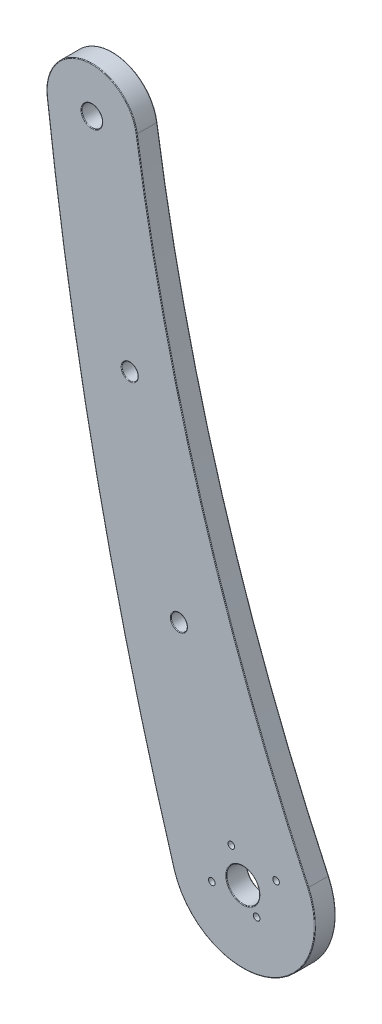
ISO-10303-21;
HEADER;
FILE_DESCRIPTION(('STEP AP214'),'2;1');
FILE_NAME('part.step','',(''),(''),'','','');
FILE_SCHEMA(('AUTOMOTIVE_DESIGN { 1 0 10303 214 1 1 1 1 }'));
ENDSEC;
DATA;
#1=APPLICATION_CONTEXT('core data for automotive mechanical design processes');
#2=APPLICATION_PROTOCOL_DEFINITION('international standard','automotive_design',2000,#1);
#3=PRODUCT_CONTEXT('',#1,'mechanical');
#4=PRODUCT('Part','Part','',(#3));
#5=PRODUCT_RELATED_PRODUCT_CATEGORY('part','',(#4));
#6=PRODUCT_DEFINITION_FORMATION('','',#4);
#7=PRODUCT_DEFINITION_CONTEXT('part definition',#1,'design');
#8=PRODUCT_DEFINITION('design','',#6,#7);
#9=PRODUCT_DEFINITION_SHAPE('','',#8);
#10=(LENGTH_UNIT() NAMED_UNIT(*) SI_UNIT(.MILLI.,.METRE.));
#11=(NAMED_UNIT(*) PLANE_ANGLE_UNIT() SI_UNIT($,.RADIAN.));
#12=(NAMED_UNIT(*) SI_UNIT($,.STERADIAN.) SOLID_ANGLE_UNIT());
#13=UNCERTAINTY_MEASURE_WITH_UNIT(LENGTH_MEASURE(1.E-05),#10,'distance_accuracy_value','');
#14=(GEOMETRIC_REPRESENTATION_CONTEXT(3) GLOBAL_UNCERTAINTY_ASSIGNED_CONTEXT((#13)) GLOBAL_UNIT_ASSIGNED_CONTEXT((#10,
#11,#12)) REPRESENTATION_CONTEXT('',''));
#15=CARTESIAN_POINT('',(0.,0.,0.));
#16=DIRECTION('',(0.,0.,1.));
#17=DIRECTION('',(1.,0.,0.));
#18=AXIS2_PLACEMENT_3D('',#15,#16,#17);
#19=CARTESIAN_POINT('',(359.713283100028,250.324845308075,5.));
#20=DIRECTION('',(0.,0.,1.));
#21=DIRECTION('',(1.,0.,0.));
#22=AXIS2_PLACEMENT_3D('',#19,#20,#21);
#23=PLANE('',#22);
#24=CARTESIAN_POINT('',(-27.7406146200843,54.6087694983637,5.));
#25=DIRECTION('',(0.,0.,1.));
#26=DIRECTION('',(1.,0.,0.));
#27=AXIS2_PLACEMENT_3D('',#24,#25,#26);
#28=CIRCLE('',#27,0.800000000000006);
#29=CARTESIAN_POINT('',(-26.9406146200843,54.6087694983637,5.));
#30=VERTEX_POINT('',#29);
#31=EDGE_CURVE('E266',#30,#30,#28,.T.);
#32=ORIENTED_EDGE('',*,*,#31,.F.);
#33=EDGE_LOOP('',(#32));
#34=FACE_BOUND('',#33,.T.);
#35=CARTESIAN_POINT('',(-16.8774012050253,52.580076742207,5.));
#36=DIRECTION('',(0.,0.,1.));
#37=DIRECTION('',(1.,0.,0.));
#38=AXIS2_PLACEMENT_3D('',#35,#36,#37);
#39=CIRCLE('',#38,0.800000000000006);
#40=CARTESIAN_POINT('',(-16.0774012050253,52.580076742207,5.));
#41=VERTEX_POINT('',#40);
#42=EDGE_CURVE('E260',#41,#41,#39,.T.);
#43=ORIENTED_EDGE('',*,*,#42,.F.);
#44=EDGE_LOOP('',(#43));
#45=FACE_BOUND('',#44,.T.);
#46=CARTESIAN_POINT('',(-23.0208688867139,64.6012166567095,5.));
#47=DIRECTION('',(0.,0.,1.));
#48=DIRECTION('',(1.,0.,0.));
#49=AXIS2_PLACEMENT_3D('',#46,#47,#48);
#50=CIRCLE('',#49,0.800000000000004);
#51=CARTESIAN_POINT('',(-22.2208688867139,64.6012166567095,5.));
#52=VERTEX_POINT('',#51);
#53=EDGE_CURVE('E254',#52,#52,#50,.T.);
#54=ORIENTED_EDGE('',*,*,#53,.F.);
#55=EDGE_LOOP('',(#54));
#56=FACE_BOUND('',#55,.T.);
#57=CARTESIAN_POINT('',(-12.157655471655,62.5725239005527,5.));
#58=DIRECTION('',(0.,0.,1.));
#59=DIRECTION('',(1.,0.,0.));
#60=AXIS2_PLACEMENT_3D('',#57,#58,#59);
#61=CIRCLE('',#60,0.799999999999994);
#62=CARTESIAN_POINT('',(-11.357655471655,62.5725239005527,5.));
#63=VERTEX_POINT('',#62);
#64=EDGE_CURVE('E248',#63,#63,#61,.T.);
#65=ORIENTED_EDGE('',*,*,#64,.F.);
#66=EDGE_LOOP('',(#65));
#67=FACE_BOUND('',#66,.T.);
#68=CARTESIAN_POINT('',(-20.2200000000001,57.5800000000001,5.));
#69=DIRECTION('',(0.,0.,1.));
#70=DIRECTION('',(1.,0.,0.));
#71=AXIS2_PLACEMENT_3D('',#68,#69,#70);
#72=CIRCLE('',#71,4.15);
#73=CARTESIAN_POINT('',(-16.0700000000001,57.5800000000001,5.));
#74=VERTEX_POINT('',#73);
#75=EDGE_CURVE('E11',#74,#74,#72,.F.);
#76=ORIENTED_EDGE('',*,*,#75,.T.);
#77=EDGE_LOOP('',(#76));
#78=FACE_BOUND('',#77,.T.);
#79=CARTESIAN_POINT('',(-20.22,57.58,5.));
#80=DIRECTION('',(0.,0.,1.));
#81=DIRECTION('',(1.,0.,0.));
#82=AXIS2_PLACEMENT_3D('',#79,#80,#81);
#83=CIRCLE('',#82,17.3499999999998);
#84=CARTESIAN_POINT('',(-36.8201416739153,52.5344280397623,5.));
#85=VERTEX_POINT('',#84);
#86=CARTESIAN_POINT('',(-4.50781058356829,64.9386414331836,5.));
#87=VERTEX_POINT('',#86);
#88=EDGE_CURVE('E49',#85,#87,#83,.T.);
#89=ORIENTED_EDGE('',*,*,#88,.T.);
#90=CARTESIAN_POINT('',(448.428877406544,277.066855427805,5.));
#91=DIRECTION('',(0.,0.,1.));
#92=DIRECTION('',(1.,0.,0.));
#93=AXIS2_PLACEMENT_3D('',#90,#91,#92);
#94=CIRCLE('',#93,500.15);
#95=CARTESIAN_POINT('',(-46.1441832858885,202.585246037838,5.));
#96=VERTEX_POINT('',#95);
#97=EDGE_CURVE('E41',#87,#96,#94,.F.);
#98=ORIENTED_EDGE('',*,*,#97,.T.);
#99=CARTESIAN_POINT('',(-56.8731999979007,200.969479843934,5.));
#100=DIRECTION('',(0.,0.,1.));
#101=DIRECTION('',(1.,0.,0.));
#102=AXIS2_PLACEMENT_3D('',#99,#100,#101);
#103=CIRCLE('',#102,10.8499999999999);
#104=CARTESIAN_POINT('',(-67.6478444355944,199.692946553622,5.));
#105=VERTEX_POINT('',#104);
#106=EDGE_CURVE('E186',#96,#105,#103,.T.);
#107=ORIENTED_EDGE('',*,*,#106,.T.);
#108=CARTESIAN_POINT('',(776.299766197957,299.680210772216,5.));
#109=DIRECTION('',(0.,0.,1.));
#110=DIRECTION('',(1.,0.,0.));
#111=AXIS2_PLACEMENT_3D('',#108,#109,#110);
#112=CIRCLE('',#111,849.85);
#113=EDGE_CURVE('E54',#105,#85,#112,.T.);
#114=ORIENTED_EDGE('',*,*,#113,.T.);
#115=EDGE_LOOP('',(#89,#98,#107,#114));
#116=FACE_BOUND('',#115,.T.);
#117=CARTESIAN_POINT('',(-56.8731999979007,200.969479843934,5.));
#118=DIRECTION('',(0.,0.,1.));
#119=DIRECTION('',(1.,0.,0.));
#120=AXIS2_PLACEMENT_3D('',#117,#118,#119);
#121=CIRCLE('',#120,2.65000000000001);
#122=CARTESIAN_POINT('',(-54.2231999979007,200.969479843934,5.));
#123=VERTEX_POINT('',#122);
#124=EDGE_CURVE('E183',#123,#123,#121,.F.);
#125=ORIENTED_EDGE('',*,*,#124,.T.);
#126=EDGE_LOOP('',(#125));
#127=FACE_BOUND('',#126,.T.);
#128=CARTESIAN_POINT('',(-35.7464202873909,105.108205026692,5.));
#129=DIRECTION('',(0.,0.,1.));
#130=DIRECTION('',(1.,0.,0.));
#131=AXIS2_PLACEMENT_3D('',#128,#129,#130);
#132=CIRCLE('',#131,2.09999999999999);
#133=CARTESIAN_POINT('',(-33.6464202873909,105.108205026692,5.));
#134=VERTEX_POINT('',#133);
#135=EDGE_CURVE('E180',#134,#134,#132,.F.);
#136=ORIENTED_EDGE('',*,*,#135,.T.);
#137=EDGE_LOOP('',(#136));
#138=FACE_BOUND('',#137,.T.);
#139=CARTESIAN_POINT('',(-47.6870315612747,151.820580472188,5.));
#140=DIRECTION('',(0.,0.,1.));
#141=DIRECTION('',(1.,0.,0.));
#142=AXIS2_PLACEMENT_3D('',#139,#140,#141);
#143=CIRCLE('',#142,2.09999999999999);
#144=CARTESIAN_POINT('',(-45.5870315612747,151.820580472188,5.));
#145=VERTEX_POINT('',#144);
#146=EDGE_CURVE('E177',#145,#145,#143,.F.);
#147=ORIENTED_EDGE('',*,*,#146,.T.);
#148=EDGE_LOOP('',(#147));
#149=FACE_BOUND('',#148,.T.);
#150=ADVANCED_FACE('F32',(#34,#45,#56,#67,#78,#116,#127,#138,#149),#23,.T.);
#151=CARTESIAN_POINT('',(359.713283100028,250.324845308075,0.));
#152=DIRECTION('',(0.,0.,1.));
#153=DIRECTION('',(1.,0.,0.));
#154=AXIS2_PLACEMENT_3D('',#151,#152,#153);
#155=PLANE('',#154);
#156=CARTESIAN_POINT('',(-27.7406146200843,54.6087694983637,0.));
#157=DIRECTION('',(0.,0.,1.));
#158=DIRECTION('',(1.,0.,0.));
#159=AXIS2_PLACEMENT_3D('',#156,#157,#158);
#160=CIRCLE('',#159,0.800000000000006);
#161=CARTESIAN_POINT('',(-26.9406146200843,54.6087694983637,0.));
#162=VERTEX_POINT('',#161);
#163=EDGE_CURVE('E199',#162,#162,#160,.T.);
#164=ORIENTED_EDGE('',*,*,#163,.T.);
#165=EDGE_LOOP('',(#164));
#166=FACE_BOUND('',#165,.T.);
#167=CARTESIAN_POINT('',(-16.8774012050253,52.580076742207,0.));
#168=DIRECTION('',(0.,0.,1.));
#169=DIRECTION('',(1.,0.,0.));
#170=AXIS2_PLACEMENT_3D('',#167,#168,#169);
#171=CIRCLE('',#170,0.800000000000006);
#172=CARTESIAN_POINT('',(-16.0774012050253,52.580076742207,0.));
#173=VERTEX_POINT('',#172);
#174=EDGE_CURVE('E263',#173,#173,#171,.T.);
#175=ORIENTED_EDGE('',*,*,#174,.T.);
#176=EDGE_LOOP('',(#175));
#177=FACE_BOUND('',#176,.T.);
#178=CARTESIAN_POINT('',(-23.0208688867139,64.6012166567095,0.));
#179=DIRECTION('',(0.,0.,1.));
#180=DIRECTION('',(1.,0.,0.));
#181=AXIS2_PLACEMENT_3D('',#178,#179,#180);
#182=CIRCLE('',#181,0.800000000000004);
#183=CARTESIAN_POINT('',(-22.2208688867139,64.6012166567095,0.));
#184=VERTEX_POINT('',#183);
#185=EDGE_CURVE('E257',#184,#184,#182,.T.);
#186=ORIENTED_EDGE('',*,*,#185,.T.);
#187=EDGE_LOOP('',(#186));
#188=FACE_BOUND('',#187,.T.);
#189=CARTESIAN_POINT('',(-12.157655471655,62.5725239005527,0.));
#190=DIRECTION('',(0.,0.,1.));
#191=DIRECTION('',(1.,0.,0.));
#192=AXIS2_PLACEMENT_3D('',#189,#190,#191);
#193=CIRCLE('',#192,0.799999999999994);
#194=CARTESIAN_POINT('',(-11.357655471655,62.5725239005527,0.));
#195=VERTEX_POINT('',#194);
#196=EDGE_CURVE('E251',#195,#195,#193,.T.);
#197=ORIENTED_EDGE('',*,*,#196,.T.);
#198=EDGE_LOOP('',(#197));
#199=FACE_BOUND('',#198,.T.);
#200=CARTESIAN_POINT('',(-20.2200000000001,57.5800000000001,0.));
#201=DIRECTION('',(0.,0.,1.));
#202=DIRECTION('',(1.,0.,0.));
#203=AXIS2_PLACEMENT_3D('',#200,#201,#202);
#204=CIRCLE('',#203,4.15);
#205=CARTESIAN_POINT('',(-16.0700000000001,57.5800000000001,0.));
#206=VERTEX_POINT('',#205);
#207=EDGE_CURVE('E130',#206,#206,#204,.T.);
#208=ORIENTED_EDGE('',*,*,#207,.T.);
#209=EDGE_LOOP('',(#208));
#210=FACE_BOUND('',#209,.T.);
#211=CARTESIAN_POINT('',(-56.8731999979007,200.969479843934,0.));
#212=DIRECTION('',(0.,0.,1.));
#213=DIRECTION('',(1.,0.,0.));
#214=AXIS2_PLACEMENT_3D('',#211,#212,#213);
#215=CIRCLE('',#214,2.65000000000001);
#216=CARTESIAN_POINT('',(-54.2231999979007,200.969479843934,0.));
#217=VERTEX_POINT('',#216);
#218=EDGE_CURVE('E127',#217,#217,#215,.T.);
#219=ORIENTED_EDGE('',*,*,#218,.T.);
#220=EDGE_LOOP('',(#219));
#221=FACE_BOUND('',#220,.T.);
#222=CARTESIAN_POINT('',(-20.22,57.58,0.));
#223=DIRECTION('',(0.,0.,1.));
#224=DIRECTION('',(1.,0.,0.));
#225=AXIS2_PLACEMENT_3D('',#222,#223,#224);
#226=CIRCLE('',#225,17.3499999999998);
#227=CARTESIAN_POINT('',(-4.50781058356829,64.9386414331836,0.));
#228=VERTEX_POINT('',#227);
#229=CARTESIAN_POINT('',(-36.8201416739152,52.5344280397623,0.));
#230=VERTEX_POINT('',#229);
#231=EDGE_CURVE('E126',#228,#230,#226,.F.);
#232=ORIENTED_EDGE('',*,*,#231,.T.);
#233=CARTESIAN_POINT('',(776.299766197957,299.680210772216,0.));
#234=DIRECTION('',(0.,0.,1.));
#235=DIRECTION('',(1.,0.,0.));
#236=AXIS2_PLACEMENT_3D('',#233,#234,#235);
#237=CIRCLE('',#236,849.85);
#238=CARTESIAN_POINT('',(-67.6478444355944,199.692946553622,0.));
#239=VERTEX_POINT('',#238);
#240=EDGE_CURVE('E104',#230,#239,#237,.F.);
#241=ORIENTED_EDGE('',*,*,#240,.T.);
#242=CARTESIAN_POINT('',(-56.8731999979007,200.969479843934,0.));
#243=DIRECTION('',(0.,0.,1.));
#244=DIRECTION('',(1.,0.,0.));
#245=AXIS2_PLACEMENT_3D('',#242,#243,#244);
#246=CIRCLE('',#245,10.8499999999999);
#247=CARTESIAN_POINT('',(-46.1441832858885,202.585246037838,0.));
#248=VERTEX_POINT('',#247);
#249=EDGE_CURVE('E114',#239,#248,#246,.F.);
#250=ORIENTED_EDGE('',*,*,#249,.T.);
#251=CARTESIAN_POINT('',(448.428877406544,277.066855427805,0.));
#252=DIRECTION('',(0.,0.,1.));
#253=DIRECTION('',(1.,0.,0.));
#254=AXIS2_PLACEMENT_3D('',#251,#252,#253);
#255=CIRCLE('',#254,500.15);
#256=EDGE_CURVE('E120',#248,#228,#255,.T.);
#257=ORIENTED_EDGE('',*,*,#256,.T.);
#258=EDGE_LOOP('',(#232,#241,#250,#257));
#259=FACE_BOUND('',#258,.T.);
#260=CARTESIAN_POINT('',(-35.7464202873909,105.108205026692,0.));
#261=DIRECTION('',(0.,0.,1.));
#262=DIRECTION('',(1.,0.,0.));
#263=AXIS2_PLACEMENT_3D('',#260,#261,#262);
#264=CIRCLE('',#263,2.09999999999999);
#265=CARTESIAN_POINT('',(-33.6464202873909,105.108205026692,0.));
#266=VERTEX_POINT('',#265);
#267=EDGE_CURVE('E121',#266,#266,#264,.T.);
#268=ORIENTED_EDGE('',*,*,#267,.T.);
#269=EDGE_LOOP('',(#268));
#270=FACE_BOUND('',#269,.T.);
#271=CARTESIAN_POINT('',(-47.6870315612747,151.820580472188,0.));
#272=DIRECTION('',(0.,0.,1.));
#273=DIRECTION('',(1.,0.,0.));
#274=AXIS2_PLACEMENT_3D('',#271,#272,#273);
#275=CIRCLE('',#274,2.09999999999999);
#276=CARTESIAN_POINT('',(-45.5870315612747,151.820580472188,0.));
#277=VERTEX_POINT('',#276);
#278=EDGE_CURVE('E225',#277,#277,#275,.T.);
#279=ORIENTED_EDGE('',*,*,#278,.T.);
#280=EDGE_LOOP('',(#279));
#281=FACE_BOUND('',#280,.T.);
#282=ADVANCED_FACE('F123',(#166,#177,#188,#199,#210,#221,#259,#270,#281),#155,.F.);
#283=CARTESIAN_POINT('',(-56.8731999979007,200.969479843934,5.));
#284=DIRECTION('',(0.,0.,-1.));
#285=DIRECTION('',(-1.,0.,0.));
#286=AXIS2_PLACEMENT_3D('',#283,#284,#285);
#287=CYLINDRICAL_SURFACE('',#286,10.9999999999999);
#288=DIRECTION('',(0.,0.,-1.));
#289=VECTOR('',#288,1.);
#290=CARTESIAN_POINT('',(-45.9958558659068,202.60758381932,5.));
#291=LINE('',#290,#289);
#292=CARTESIAN_POINT('',(-45.9958558659068,202.60758381932,4.85));
#293=VERTEX_POINT('',#292);
#294=CARTESIAN_POINT('',(-45.9958558659068,202.60758381932,0.15));
#295=VERTEX_POINT('',#294);
#296=EDGE_CURVE('E195',#293,#295,#291,.T.);
#297=ORIENTED_EDGE('',*,*,#296,.T.);
#298=CARTESIAN_POINT('',(-56.8731999979007,200.969479843934,0.15));
#299=DIRECTION('',(0.,0.,1.));
#300=DIRECTION('',(1.,0.,0.));
#301=AXIS2_PLACEMENT_3D('',#298,#299,#300);
#302=CIRCLE('',#301,10.9999999999999);
#303=CARTESIAN_POINT('',(-67.796802653627,199.675298627949,0.15));
#304=VERTEX_POINT('',#303);
#305=EDGE_CURVE('E163',#295,#304,#302,.T.);
#306=ORIENTED_EDGE('',*,*,#305,.T.);
#307=DIRECTION('',(0.,0.,-1.));
#308=VECTOR('',#307,1.);
#309=CARTESIAN_POINT('',(-67.796802653627,199.675298627949,5.));
#310=LINE('',#309,#308);
#311=CARTESIAN_POINT('',(-67.796802653627,199.675298627949,4.85));
#312=VERTEX_POINT('',#311);
#313=EDGE_CURVE('E218',#312,#304,#310,.T.);
#314=ORIENTED_EDGE('',*,*,#313,.F.);
#315=CARTESIAN_POINT('',(-56.8731999979007,200.969479843934,4.85));
#316=DIRECTION('',(0.,0.,1.));
#317=DIRECTION('',(1.,0.,0.));
#318=AXIS2_PLACEMENT_3D('',#315,#316,#317);
#319=CIRCLE('',#318,10.9999999999999);
#320=EDGE_CURVE('E161',#312,#293,#319,.F.);
#321=ORIENTED_EDGE('',*,*,#320,.T.);
#322=EDGE_LOOP('',(#297,#306,#314,#321));
#323=FACE_BOUND('',#322,.T.);
#324=ADVANCED_FACE('F223',(#323),#287,.T.);
#325=CARTESIAN_POINT('',(776.299766197957,299.680210772216,5.));
#326=DIRECTION('',(0.,0.,-1.));
#327=DIRECTION('',(-1.,0.,0.));
#328=AXIS2_PLACEMENT_3D('',#325,#326,#327);
#329=CYLINDRICAL_SURFACE('',#328,850.);
#330=ORIENTED_EDGE('',*,*,#313,.T.);
#331=CARTESIAN_POINT('',(776.299766197957,299.680210772216,0.15));
#332=DIRECTION('',(0.,0.,1.));
#333=DIRECTION('',(1.,0.,0.));
#334=AXIS2_PLACEMENT_3D('',#331,#332,#333);
#335=CIRCLE('',#334,850.);
#336=CARTESIAN_POINT('',(-36.9636587489058,52.4908063801637,0.15));
#337=VERTEX_POINT('',#336);
#338=EDGE_CURVE('E107',#304,#337,#335,.T.);
#339=ORIENTED_EDGE('',*,*,#338,.T.);
#340=DIRECTION('',(0.,0.,-1.));
#341=VECTOR('',#340,1.);
#342=CARTESIAN_POINT('',(-36.9636587489058,52.4908063801637,5.));
#343=LINE('',#342,#341);
#344=CARTESIAN_POINT('',(-36.9636587489058,52.4908063801637,4.85));
#345=VERTEX_POINT('',#344);
#346=EDGE_CURVE('E220',#345,#337,#343,.T.);
#347=ORIENTED_EDGE('',*,*,#346,.F.);
#348=CARTESIAN_POINT('',(776.299766197957,299.680210772216,4.85));
#349=DIRECTION('',(0.,0.,1.));
#350=DIRECTION('',(1.,0.,0.));
#351=AXIS2_PLACEMENT_3D('',#348,#349,#350);
#352=CIRCLE('',#351,850.);
#353=EDGE_CURVE('E149',#345,#312,#352,.F.);
#354=ORIENTED_EDGE('',*,*,#353,.T.);
#355=EDGE_LOOP('',(#330,#339,#347,#354));
#356=FACE_BOUND('',#355,.T.);
#357=ADVANCED_FACE('F217',(#356),#329,.T.);
#358=CARTESIAN_POINT('',(-20.22,57.58,5.));
#359=DIRECTION('',(0.,0.,-1.));
#360=DIRECTION('',(-1.,0.,0.));
#361=AXIS2_PLACEMENT_3D('',#358,#359,#360);
#362=CYLINDRICAL_SURFACE('',#361,17.4999999999998);
#363=ORIENTED_EDGE('',*,*,#346,.T.);
#364=CARTESIAN_POINT('',(-20.22,57.58,0.15));
#365=DIRECTION('',(0.,0.,1.));
#366=DIRECTION('',(1.,0.,0.));
#367=AXIS2_PLACEMENT_3D('',#364,#365,#366);
#368=CIRCLE('',#367,17.4999999999998);
#369=CARTESIAN_POINT('',(-4.37197032924758,65.0022608115685,0.15));
#370=VERTEX_POINT('',#369);
#371=EDGE_CURVE('E154',#337,#370,#368,.T.);
#372=ORIENTED_EDGE('',*,*,#371,.T.);
#373=DIRECTION('',(0.,0.,-1.));
#374=VECTOR('',#373,1.);
#375=CARTESIAN_POINT('',(-4.37197032924758,65.0022608115685,5.));
#376=LINE('',#375,#374);
#377=CARTESIAN_POINT('',(-4.37197032924758,65.0022608115685,4.85));
#378=VERTEX_POINT('',#377);
#379=EDGE_CURVE('E229',#378,#370,#376,.T.);
#380=ORIENTED_EDGE('',*,*,#379,.F.);
#381=CARTESIAN_POINT('',(-20.22,57.58,4.85));
#382=DIRECTION('',(0.,0.,1.));
#383=DIRECTION('',(1.,0.,0.));
#384=AXIS2_PLACEMENT_3D('',#381,#382,#383);
#385=CIRCLE('',#384,17.4999999999998);
#386=EDGE_CURVE('E152',#378,#345,#385,.F.);
#387=ORIENTED_EDGE('',*,*,#386,.T.);
#388=EDGE_LOOP('',(#363,#372,#380,#387));
#389=FACE_BOUND('',#388,.T.);
#390=ADVANCED_FACE('F244',(#389),#362,.T.);
#391=CARTESIAN_POINT('',(448.428877406544,277.066855427805,5.));
#392=DIRECTION('',(0.,0.,-1.));
#393=DIRECTION('',(-1.,0.,0.));
#394=AXIS2_PLACEMENT_3D('',#391,#392,#393);
#395=CYLINDRICAL_SURFACE('',#394,500.);
#396=ORIENTED_EDGE('',*,*,#379,.T.);
#397=CARTESIAN_POINT('',(448.428877406544,277.066855427805,0.15));
#398=DIRECTION('',(0.,0.,1.));
#399=DIRECTION('',(1.,0.,0.));
#400=AXIS2_PLACEMENT_3D('',#397,#398,#399);
#401=CIRCLE('',#400,500.);
#402=EDGE_CURVE('E159',#370,#295,#401,.F.);
#403=ORIENTED_EDGE('',*,*,#402,.T.);
#404=ORIENTED_EDGE('',*,*,#296,.F.);
#405=CARTESIAN_POINT('',(448.428877406544,277.066855427805,4.85));
#406=DIRECTION('',(0.,0.,1.));
#407=DIRECTION('',(1.,0.,0.));
#408=AXIS2_PLACEMENT_3D('',#405,#406,#407);
#409=CIRCLE('',#408,500.);
#410=EDGE_CURVE('E156',#293,#378,#409,.T.);
#411=ORIENTED_EDGE('',*,*,#410,.T.);
#412=EDGE_LOOP('',(#396,#403,#404,#411));
#413=FACE_BOUND('',#412,.T.);
#414=ADVANCED_FACE('F328',(#413),#395,.F.);
#415=CARTESIAN_POINT('',(-56.8731999979007,200.969479843934,5.));
#416=DIRECTION('',(0.,0.,-1.));
#417=DIRECTION('',(-1.,0.,0.));
#418=AXIS2_PLACEMENT_3D('',#415,#416,#417);
#419=CYLINDRICAL_SURFACE('',#418,2.50000000000001);
#420=CARTESIAN_POINT('',(-56.8731999979007,200.969479843934,0.15));
#421=DIRECTION('',(0.,0.,1.));
#422=DIRECTION('',(1.,0.,0.));
#423=AXIS2_PLACEMENT_3D('',#420,#421,#422);
#424=CIRCLE('',#423,2.50000000000001);
#425=CARTESIAN_POINT('',(-54.3731999979006,200.969479843934,0.15));
#426=VERTEX_POINT('',#425);
#427=EDGE_CURVE('E146',#426,#426,#424,.F.);
#428=ORIENTED_EDGE('',*,*,#427,.T.);
#429=EDGE_LOOP('',(#428));
#430=FACE_BOUND('',#429,.T.);
#431=CARTESIAN_POINT('',(-56.8731999979007,200.969479843934,4.85));
#432=DIRECTION('',(0.,0.,1.));
#433=DIRECTION('',(1.,0.,0.));
#434=AXIS2_PLACEMENT_3D('',#431,#432,#433);
#435=CIRCLE('',#434,2.50000000000001);
#436=CARTESIAN_POINT('',(-54.3731999979006,200.969479843934,4.85));
#437=VERTEX_POINT('',#436);
#438=EDGE_CURVE('E143',#437,#437,#435,.T.);
#439=ORIENTED_EDGE('',*,*,#438,.T.);
#440=EDGE_LOOP('',(#439));
#441=FACE_BOUND('',#440,.T.);
#442=ADVANCED_FACE('F325',(#430,#441),#419,.F.);
#443=CARTESIAN_POINT('',(-20.2200000000001,57.5800000000001,5.));
#444=DIRECTION('',(0.,0.,-1.));
#445=DIRECTION('',(-1.,0.,0.));
#446=AXIS2_PLACEMENT_3D('',#443,#444,#445);
#447=CYLINDRICAL_SURFACE('',#446,4.);
#448=CARTESIAN_POINT('',(-20.2200000000001,57.5800000000001,0.15));
#449=DIRECTION('',(0.,0.,1.));
#450=DIRECTION('',(1.,0.,0.));
#451=AXIS2_PLACEMENT_3D('',#448,#449,#450);
#452=CIRCLE('',#451,4.);
#453=CARTESIAN_POINT('',(-16.2200000000001,57.5800000000001,0.15));
#454=VERTEX_POINT('',#453);
#455=EDGE_CURVE('E140',#454,#454,#452,.F.);
#456=ORIENTED_EDGE('',*,*,#455,.T.);
#457=EDGE_LOOP('',(#456));
#458=FACE_BOUND('',#457,.T.);
#459=CARTESIAN_POINT('',(-20.2200000000001,57.5800000000001,4.85));
#460=DIRECTION('',(0.,0.,1.));
#461=DIRECTION('',(1.,0.,0.));
#462=AXIS2_PLACEMENT_3D('',#459,#460,#461);
#463=CIRCLE('',#462,4.);
#464=CARTESIAN_POINT('',(-16.2200000000001,57.5800000000001,4.85));
#465=VERTEX_POINT('',#464);
#466=EDGE_CURVE('E137',#465,#465,#463,.T.);
#467=ORIENTED_EDGE('',*,*,#466,.T.);
#468=EDGE_LOOP('',(#467));
#469=FACE_BOUND('',#468,.T.);
#470=ADVANCED_FACE('F317',(#458,#469),#447,.F.);
#471=CARTESIAN_POINT('',(-35.7464202873909,105.108205026692,5.));
#472=DIRECTION('',(0.,0.,1.));
#473=DIRECTION('',(1.,0.,0.));
#474=AXIS2_PLACEMENT_3D('',#471,#472,#473);
#475=CYLINDRICAL_SURFACE('',#474,1.94999999999999);
#476=CARTESIAN_POINT('',(-35.7464202873909,105.108205026692,0.15));
#477=DIRECTION('',(0.,0.,1.));
#478=DIRECTION('',(1.,0.,0.));
#479=AXIS2_PLACEMENT_3D('',#476,#477,#478);
#480=CIRCLE('',#479,1.94999999999999);
#481=CARTESIAN_POINT('',(-33.7964202873909,105.108205026692,0.15));
#482=VERTEX_POINT('',#481);
#483=EDGE_CURVE('E168',#482,#482,#480,.F.);
#484=ORIENTED_EDGE('',*,*,#483,.T.);
#485=EDGE_LOOP('',(#484));
#486=FACE_BOUND('',#485,.T.);
#487=CARTESIAN_POINT('',(-35.7464202873909,105.108205026692,4.85));
#488=DIRECTION('',(0.,0.,1.));
#489=DIRECTION('',(1.,0.,0.));
#490=AXIS2_PLACEMENT_3D('',#487,#488,#489);
#491=CIRCLE('',#490,1.94999999999999);
#492=CARTESIAN_POINT('',(-33.7964202873909,105.108205026692,4.85));
#493=VERTEX_POINT('',#492);
#494=EDGE_CURVE('E165',#493,#493,#491,.T.);
#495=ORIENTED_EDGE('',*,*,#494,.T.);
#496=EDGE_LOOP('',(#495));
#497=FACE_BOUND('',#496,.T.);
#498=ADVANCED_FACE('F307',(#486,#497),#475,.F.);
#499=CARTESIAN_POINT('',(-47.6870315612747,151.820580472188,5.));
#500=DIRECTION('',(0.,0.,1.));
#501=DIRECTION('',(1.,0.,0.));
#502=AXIS2_PLACEMENT_3D('',#499,#500,#501);
#503=CYLINDRICAL_SURFACE('',#502,1.94999999999999);
#504=CARTESIAN_POINT('',(-47.6870315612747,151.820580472188,0.15));
#505=DIRECTION('',(0.,0.,1.));
#506=DIRECTION('',(1.,0.,0.));
#507=AXIS2_PLACEMENT_3D('',#504,#505,#506);
#508=CIRCLE('',#507,1.94999999999999);
#509=CARTESIAN_POINT('',(-45.7370315612747,151.820580472188,0.15));
#510=VERTEX_POINT('',#509);
#511=EDGE_CURVE('E174',#510,#510,#508,.F.);
#512=ORIENTED_EDGE('',*,*,#511,.T.);
#513=EDGE_LOOP('',(#512));
#514=FACE_BOUND('',#513,.T.);
#515=CARTESIAN_POINT('',(-47.6870315612747,151.820580472188,4.85));
#516=DIRECTION('',(0.,0.,1.));
#517=DIRECTION('',(1.,0.,0.));
#518=AXIS2_PLACEMENT_3D('',#515,#516,#517);
#519=CIRCLE('',#518,1.94999999999999);
#520=CARTESIAN_POINT('',(-45.7370315612747,151.820580472188,4.85));
#521=VERTEX_POINT('',#520);
#522=EDGE_CURVE('E171',#521,#521,#519,.T.);
#523=ORIENTED_EDGE('',*,*,#522,.T.);
#524=EDGE_LOOP('',(#523));
#525=FACE_BOUND('',#524,.T.);
#526=ADVANCED_FACE('F304',(#514,#525),#503,.F.);
#527=CARTESIAN_POINT('',(-20.2200000000001,57.5800000000001,0.15));
#528=DIRECTION('',(0.,0.,1.));
#529=DIRECTION('',(1.,0.,0.));
#530=AXIS2_PLACEMENT_3D('',#527,#528,#529);
#531=TOROIDAL_SURFACE('',#530,4.15,0.15);
#532=ORIENTED_EDGE('',*,*,#455,.F.);
#533=EDGE_LOOP('',(#532));
#534=FACE_BOUND('',#533,.T.);
#535=ORIENTED_EDGE('',*,*,#207,.F.);
#536=EDGE_LOOP('',(#535));
#537=FACE_BOUND('',#536,.T.);
#538=ADVANCED_FACE('F306',(#534,#537),#531,.T.);
#539=CARTESIAN_POINT('',(-56.8731999979007,200.969479843934,0.15));
#540=DIRECTION('',(0.,0.,1.));
#541=DIRECTION('',(1.,0.,0.));
#542=AXIS2_PLACEMENT_3D('',#539,#540,#541);
#543=TOROIDAL_SURFACE('',#542,2.65000000000001,0.15);
#544=ORIENTED_EDGE('',*,*,#427,.F.);
#545=EDGE_LOOP('',(#544));
#546=FACE_BOUND('',#545,.T.);
#547=ORIENTED_EDGE('',*,*,#218,.F.);
#548=EDGE_LOOP('',(#547));
#549=FACE_BOUND('',#548,.T.);
#550=ADVANCED_FACE('F314',(#546,#549),#543,.T.);
#551=CARTESIAN_POINT('',(448.428877406544,277.066855427805,0.15));
#552=DIRECTION('',(0.,0.,1.));
#553=DIRECTION('',(1.,0.,0.));
#554=AXIS2_PLACEMENT_3D('',#551,#552,#553);
#555=TOROIDAL_SURFACE('',#554,500.15,0.15);
#556=CARTESIAN_POINT('',(-4.50781058356829,64.9386414331836,0.15));
#557=DIRECTION('',(0.424129189232417,-0.905601695471609,0.));
#558=DIRECTION('',(0.905601695471609,0.424129189232417,0.));
#559=AXIS2_PLACEMENT_3D('',#556,#557,#558);
#560=CIRCLE('',#559,0.15);
#561=EDGE_CURVE('E110',#228,#370,#560,.T.);
#562=ORIENTED_EDGE('',*,*,#561,.F.);
#563=ORIENTED_EDGE('',*,*,#256,.F.);
#564=CARTESIAN_POINT('',(-46.1441832858886,202.585246037838,0.15));
#565=DIRECTION('',(-0.148918543217043,0.98884946654489,0.));
#566=DIRECTION('',(-0.98884946654489,-0.148918543217043,0.));
#567=AXIS2_PLACEMENT_3D('',#564,#565,#566);
#568=CIRCLE('',#567,0.15);
#569=EDGE_CURVE('E117',#295,#248,#568,.T.);
#570=ORIENTED_EDGE('',*,*,#569,.F.);
#571=ORIENTED_EDGE('',*,*,#402,.F.);
#572=EDGE_LOOP('',(#562,#563,#570,#571));
#573=FACE_BOUND('',#572,.T.);
#574=ADVANCED_FACE('F237',(#573),#555,.T.);
#575=CARTESIAN_POINT('',(-56.8731999979007,200.969479843934,0.15));
#576=DIRECTION('',(0.,0.,1.));
#577=DIRECTION('',(1.,0.,0.));
#578=AXIS2_PLACEMENT_3D('',#575,#576,#577);
#579=TOROIDAL_SURFACE('',#578,10.8499999999999,0.15);
#580=ORIENTED_EDGE('',*,*,#569,.T.);
#581=ORIENTED_EDGE('',*,*,#249,.F.);
#582=CARTESIAN_POINT('',(-67.6478444355944,199.692946553622,0.15));
#583=DIRECTION('',(0.117652837816798,-0.993054786884215,0.));
#584=DIRECTION('',(0.993054786884215,0.117652837816798,0.));
#585=AXIS2_PLACEMENT_3D('',#582,#583,#584);
#586=CIRCLE('',#585,0.15);
#587=EDGE_CURVE('E100',#304,#239,#586,.T.);
#588=ORIENTED_EDGE('',*,*,#587,.F.);
#589=ORIENTED_EDGE('',*,*,#305,.F.);
#590=EDGE_LOOP('',(#580,#581,#588,#589));
#591=FACE_BOUND('',#590,.T.);
#592=ADVANCED_FACE('F115',(#591),#579,.T.);
#593=CARTESIAN_POINT('',(-20.22,57.58,0.15));
#594=DIRECTION('',(0.,0.,1.));
#595=DIRECTION('',(1.,0.,0.));
#596=AXIS2_PLACEMENT_3D('',#593,#594,#595);
#597=TOROIDAL_SURFACE('',#596,17.3499999999998,0.15);
#598=ORIENTED_EDGE('',*,*,#561,.T.);
#599=ORIENTED_EDGE('',*,*,#371,.F.);
#600=CARTESIAN_POINT('',(-36.8201416739152,52.5344280397623,0.15));
#601=DIRECTION('',(-0.290811063990661,0.956780499937483,0.));
#602=DIRECTION('',(-0.956780499937483,-0.290811063990661,0.));
#603=AXIS2_PLACEMENT_3D('',#600,#601,#602);
#604=CIRCLE('',#603,0.15);
#605=EDGE_CURVE('E111',#230,#337,#604,.T.);
#606=ORIENTED_EDGE('',*,*,#605,.F.);
#607=ORIENTED_EDGE('',*,*,#231,.F.);
#608=EDGE_LOOP('',(#598,#599,#606,#607));
#609=FACE_BOUND('',#608,.T.);
#610=ADVANCED_FACE('F240',(#609),#597,.T.);
#611=CARTESIAN_POINT('',(776.299766197957,299.680210772216,0.15));
#612=DIRECTION('',(0.,0.,1.));
#613=DIRECTION('',(1.,0.,0.));
#614=AXIS2_PLACEMENT_3D('',#611,#612,#613);
#615=TOROIDAL_SURFACE('',#614,849.85,0.15);
#616=ORIENTED_EDGE('',*,*,#587,.T.);
#617=ORIENTED_EDGE('',*,*,#240,.F.);
#618=ORIENTED_EDGE('',*,*,#605,.T.);
#619=ORIENTED_EDGE('',*,*,#338,.F.);
#620=EDGE_LOOP('',(#616,#617,#618,#619));
#621=FACE_BOUND('',#620,.T.);
#622=ADVANCED_FACE('F102',(#621),#615,.T.);
#623=CARTESIAN_POINT('',(-35.7464202873909,105.108205026692,0.15));
#624=DIRECTION('',(0.,0.,1.));
#625=DIRECTION('',(1.,0.,0.));
#626=AXIS2_PLACEMENT_3D('',#623,#624,#625);
#627=TOROIDAL_SURFACE('',#626,2.09999999999999,0.15);
#628=ORIENTED_EDGE('',*,*,#483,.F.);
#629=EDGE_LOOP('',(#628));
#630=FACE_BOUND('',#629,.T.);
#631=ORIENTED_EDGE('',*,*,#267,.F.);
#632=EDGE_LOOP('',(#631));
#633=FACE_BOUND('',#632,.T.);
#634=ADVANCED_FACE('F346',(#630,#633),#627,.T.);
#635=CARTESIAN_POINT('',(-47.6870315612747,151.820580472188,0.15));
#636=DIRECTION('',(0.,0.,1.));
#637=DIRECTION('',(1.,0.,0.));
#638=AXIS2_PLACEMENT_3D('',#635,#636,#637);
#639=TOROIDAL_SURFACE('',#638,2.09999999999999,0.15);
#640=ORIENTED_EDGE('',*,*,#511,.F.);
#641=EDGE_LOOP('',(#640));
#642=FACE_BOUND('',#641,.T.);
#643=ORIENTED_EDGE('',*,*,#278,.F.);
#644=EDGE_LOOP('',(#643));
#645=FACE_BOUND('',#644,.T.);
#646=ADVANCED_FACE('F355',(#642,#645),#639,.T.);
#647=CARTESIAN_POINT('',(-20.2200000000001,57.5800000000001,4.85));
#648=DIRECTION('',(0.,0.,1.));
#649=DIRECTION('',(1.,0.,0.));
#650=AXIS2_PLACEMENT_3D('',#647,#648,#649);
#651=TOROIDAL_SURFACE('',#650,4.15,0.15);
#652=ORIENTED_EDGE('',*,*,#75,.F.);
#653=EDGE_LOOP('',(#652));
#654=FACE_BOUND('',#653,.T.);
#655=ORIENTED_EDGE('',*,*,#466,.F.);
#656=EDGE_LOOP('',(#655));
#657=FACE_BOUND('',#656,.T.);
#658=ADVANCED_FACE('F359',(#654,#657),#651,.T.);
#659=CARTESIAN_POINT('',(776.299766197957,299.680210772216,4.85));
#660=DIRECTION('',(0.,0.,1.));
#661=DIRECTION('',(1.,0.,0.));
#662=AXIS2_PLACEMENT_3D('',#659,#660,#661);
#663=TOROIDAL_SURFACE('',#662,849.85,0.15);
#664=CARTESIAN_POINT('',(-67.6478444355943,199.692946553622,4.85));
#665=DIRECTION('',(-0.117652837816798,0.993054786884215,0.));
#666=DIRECTION('',(-0.993054786884215,-0.117652837816798,0.));
#667=AXIS2_PLACEMENT_3D('',#664,#665,#666);
#668=CIRCLE('',#667,0.15);
#669=EDGE_CURVE('E200',#312,#105,#668,.T.);
#670=ORIENTED_EDGE('',*,*,#669,.F.);
#671=ORIENTED_EDGE('',*,*,#353,.F.);
#672=CARTESIAN_POINT('',(-36.8201416739153,52.5344280397623,4.85));
#673=DIRECTION('',(0.290811063990642,-0.956780499937488,0.));
#674=DIRECTION('',(0.956780499937489,0.290811063990642,0.));
#675=AXIS2_PLACEMENT_3D('',#672,#673,#674);
#676=CIRCLE('',#675,0.15);
#677=EDGE_CURVE('E36',#85,#345,#676,.T.);
#678=ORIENTED_EDGE('',*,*,#677,.F.);
#679=ORIENTED_EDGE('',*,*,#113,.F.);
#680=EDGE_LOOP('',(#670,#671,#678,#679));
#681=FACE_BOUND('',#680,.T.);
#682=ADVANCED_FACE('F212',(#681),#663,.T.);
#683=CARTESIAN_POINT('',(-20.22,57.58,4.85));
#684=DIRECTION('',(0.,0.,1.));
#685=DIRECTION('',(1.,0.,0.));
#686=AXIS2_PLACEMENT_3D('',#683,#684,#685);
#687=TOROIDAL_SURFACE('',#686,17.3499999999998,0.15);
#688=ORIENTED_EDGE('',*,*,#677,.T.);
#689=ORIENTED_EDGE('',*,*,#386,.F.);
#690=CARTESIAN_POINT('',(-4.50781058356829,64.9386414331836,4.85));
#691=DIRECTION('',(-0.42412918923244,0.905601695471598,0.));
#692=DIRECTION('',(-0.905601695471598,-0.42412918923244,0.));
#693=AXIS2_PLACEMENT_3D('',#690,#691,#692);
#694=CIRCLE('',#693,0.15);
#695=EDGE_CURVE('E198',#87,#378,#694,.T.);
#696=ORIENTED_EDGE('',*,*,#695,.F.);
#697=ORIENTED_EDGE('',*,*,#88,.F.);
#698=EDGE_LOOP('',(#688,#689,#696,#697));
#699=FACE_BOUND('',#698,.T.);
#700=ADVANCED_FACE('F209',(#699),#687,.T.);
#701=CARTESIAN_POINT('',(-56.8731999979007,200.969479843934,4.85));
#702=DIRECTION('',(0.,0.,1.));
#703=DIRECTION('',(1.,0.,0.));
#704=AXIS2_PLACEMENT_3D('',#701,#702,#703);
#705=TOROIDAL_SURFACE('',#704,10.8499999999999,0.15);
#706=ORIENTED_EDGE('',*,*,#669,.T.);
#707=ORIENTED_EDGE('',*,*,#106,.F.);
#708=CARTESIAN_POINT('',(-46.1441832858885,202.585246037838,4.85));
#709=DIRECTION('',(0.148918543217043,-0.98884946654489,0.));
#710=DIRECTION('',(0.98884946654489,0.148918543217043,0.));
#711=AXIS2_PLACEMENT_3D('',#708,#709,#710);
#712=CIRCLE('',#711,0.15);
#713=EDGE_CURVE('E196',#293,#96,#712,.T.);
#714=ORIENTED_EDGE('',*,*,#713,.F.);
#715=ORIENTED_EDGE('',*,*,#320,.F.);
#716=EDGE_LOOP('',(#706,#707,#714,#715));
#717=FACE_BOUND('',#716,.T.);
#718=ADVANCED_FACE('F368',(#717),#705,.T.);
#719=CARTESIAN_POINT('',(448.428877406544,277.066855427805,4.85));
#720=DIRECTION('',(0.,0.,1.));
#721=DIRECTION('',(1.,0.,0.));
#722=AXIS2_PLACEMENT_3D('',#719,#720,#721);
#723=TOROIDAL_SURFACE('',#722,500.15,0.15);
#724=ORIENTED_EDGE('',*,*,#695,.T.);
#725=ORIENTED_EDGE('',*,*,#410,.F.);
#726=ORIENTED_EDGE('',*,*,#713,.T.);
#727=ORIENTED_EDGE('',*,*,#97,.F.);
#728=EDGE_LOOP('',(#724,#725,#726,#727));
#729=FACE_BOUND('',#728,.T.);
#730=ADVANCED_FACE('F364',(#729),#723,.T.);
#731=CARTESIAN_POINT('',(-56.8731999979007,200.969479843934,4.85));
#732=DIRECTION('',(0.,0.,1.));
#733=DIRECTION('',(1.,0.,0.));
#734=AXIS2_PLACEMENT_3D('',#731,#732,#733);
#735=TOROIDAL_SURFACE('',#734,2.65000000000001,0.15);
#736=ORIENTED_EDGE('',*,*,#124,.F.);
#737=EDGE_LOOP('',(#736));
#738=FACE_BOUND('',#737,.T.);
#739=ORIENTED_EDGE('',*,*,#438,.F.);
#740=EDGE_LOOP('',(#739));
#741=FACE_BOUND('',#740,.T.);
#742=ADVANCED_FACE('F367',(#738,#741),#735,.T.);
#743=CARTESIAN_POINT('',(-35.7464202873909,105.108205026692,4.85));
#744=DIRECTION('',(0.,0.,1.));
#745=DIRECTION('',(1.,0.,0.));
#746=AXIS2_PLACEMENT_3D('',#743,#744,#745);
#747=TOROIDAL_SURFACE('',#746,2.09999999999999,0.15);
#748=ORIENTED_EDGE('',*,*,#135,.F.);
#749=EDGE_LOOP('',(#748));
#750=FACE_BOUND('',#749,.T.);
#751=ORIENTED_EDGE('',*,*,#494,.F.);
#752=EDGE_LOOP('',(#751));
#753=FACE_BOUND('',#752,.T.);
#754=ADVANCED_FACE('F301',(#750,#753),#747,.T.);
#755=CARTESIAN_POINT('',(-47.6870315612747,151.820580472188,4.85));
#756=DIRECTION('',(0.,0.,1.));
#757=DIRECTION('',(1.,0.,0.));
#758=AXIS2_PLACEMENT_3D('',#755,#756,#757);
#759=TOROIDAL_SURFACE('',#758,2.09999999999999,0.15);
#760=ORIENTED_EDGE('',*,*,#146,.F.);
#761=EDGE_LOOP('',(#760));
#762=FACE_BOUND('',#761,.T.);
#763=ORIENTED_EDGE('',*,*,#522,.F.);
#764=EDGE_LOOP('',(#763));
#765=FACE_BOUND('',#764,.T.);
#766=ADVANCED_FACE('F34',(#762,#765),#759,.T.);
#767=CARTESIAN_POINT('',(-12.157655471655,62.5725239005527,0.));
#768=DIRECTION('',(0.,0.,1.));
#769=DIRECTION('',(1.,0.,0.));
#770=AXIS2_PLACEMENT_3D('',#767,#768,#769);
#771=CYLINDRICAL_SURFACE('',#770,0.799999999999994);
#772=ORIENTED_EDGE('',*,*,#196,.F.);
#773=EDGE_LOOP('',(#772));
#774=FACE_BOUND('',#773,.T.);
#775=ORIENTED_EDGE('',*,*,#64,.T.);
#776=EDGE_LOOP('',(#775));
#777=FACE_BOUND('',#776,.T.);
#778=ADVANCED_FACE('F300',(#774,#777),#771,.F.);
#779=CARTESIAN_POINT('',(-23.0208688867139,64.6012166567095,0.));
#780=DIRECTION('',(0.,0.,1.));
#781=DIRECTION('',(1.,0.,0.));
#782=AXIS2_PLACEMENT_3D('',#779,#780,#781);
#783=CYLINDRICAL_SURFACE('',#782,0.800000000000004);
#784=ORIENTED_EDGE('',*,*,#185,.F.);
#785=EDGE_LOOP('',(#784));
#786=FACE_BOUND('',#785,.T.);
#787=ORIENTED_EDGE('',*,*,#53,.T.);
#788=EDGE_LOOP('',(#787));
#789=FACE_BOUND('',#788,.T.);
#790=ADVANCED_FACE('F398',(#786,#789),#783,.F.);
#791=CARTESIAN_POINT('',(-16.8774012050253,52.580076742207,0.));
#792=DIRECTION('',(0.,0.,1.));
#793=DIRECTION('',(1.,0.,0.));
#794=AXIS2_PLACEMENT_3D('',#791,#792,#793);
#795=CYLINDRICAL_SURFACE('',#794,0.800000000000006);
#796=ORIENTED_EDGE('',*,*,#174,.F.);
#797=EDGE_LOOP('',(#796));
#798=FACE_BOUND('',#797,.T.);
#799=ORIENTED_EDGE('',*,*,#42,.T.);
#800=EDGE_LOOP('',(#799));
#801=FACE_BOUND('',#800,.T.);
#802=ADVANCED_FACE('F277',(#798,#801),#795,.F.);
#803=CARTESIAN_POINT('',(-27.7406146200843,54.6087694983637,0.));
#804=DIRECTION('',(0.,0.,1.));
#805=DIRECTION('',(1.,0.,0.));
#806=AXIS2_PLACEMENT_3D('',#803,#804,#805);
#807=CYLINDRICAL_SURFACE('',#806,0.800000000000006);
#808=ORIENTED_EDGE('',*,*,#163,.F.);
#809=EDGE_LOOP('',(#808));
#810=FACE_BOUND('',#809,.T.);
#811=ORIENTED_EDGE('',*,*,#31,.T.);
#812=EDGE_LOOP('',(#811));
#813=FACE_BOUND('',#812,.T.);
#814=ADVANCED_FACE('F274',(#810,#813),#807,.F.);
#815=CLOSED_SHELL('',(#150,#282,#324,#357,#390,#414,#442,#470,#498,#526,#538,#550,#574,#592,
#610,#622,#634,#646,#658,#682,#700,#718,#730,#742,#754,#766,#778,#790,#802,#814));
#816=MANIFOLD_SOLID_BREP('B2',#815);
#817=ADVANCED_BREP_SHAPE_REPRESENTATION('',(#18,#816),#14);
#818=SHAPE_DEFINITION_REPRESENTATION(#9,#817);
ENDSEC;
END-ISO-10303-21;
